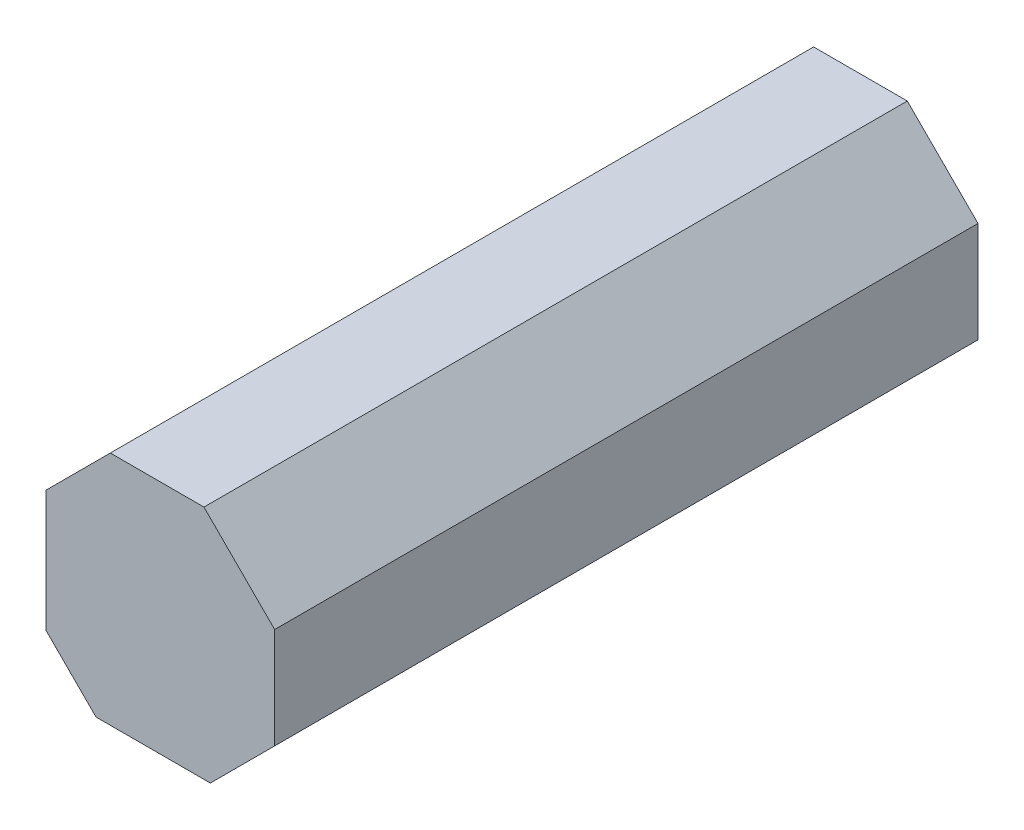
ISO-10303-21;
HEADER;
FILE_DESCRIPTION(('STEP AP214'),'2;1');
FILE_NAME('part.step','',(''),(''),'','','');
FILE_SCHEMA(('AUTOMOTIVE_DESIGN { 1 0 10303 214 1 1 1 1 }'));
ENDSEC;
DATA;
#1=APPLICATION_CONTEXT('core data for automotive mechanical design processes');
#2=APPLICATION_PROTOCOL_DEFINITION('international standard','automotive_design',2000,#1);
#3=PRODUCT_CONTEXT('',#1,'mechanical');
#4=PRODUCT('Part','Part','',(#3));
#5=PRODUCT_RELATED_PRODUCT_CATEGORY('part','',(#4));
#6=PRODUCT_DEFINITION_FORMATION('','',#4);
#7=PRODUCT_DEFINITION_CONTEXT('part definition',#1,'design');
#8=PRODUCT_DEFINITION('design','',#6,#7);
#9=PRODUCT_DEFINITION_SHAPE('','',#8);
#10=(LENGTH_UNIT() NAMED_UNIT(*) SI_UNIT(.MILLI.,.METRE.));
#11=(NAMED_UNIT(*) PLANE_ANGLE_UNIT() SI_UNIT($,.RADIAN.));
#12=(NAMED_UNIT(*) SI_UNIT($,.STERADIAN.) SOLID_ANGLE_UNIT());
#13=UNCERTAINTY_MEASURE_WITH_UNIT(LENGTH_MEASURE(1.E-05),#10,'distance_accuracy_value','');
#14=(GEOMETRIC_REPRESENTATION_CONTEXT(3) GLOBAL_UNCERTAINTY_ASSIGNED_CONTEXT((#13)) GLOBAL_UNIT_ASSIGNED_CONTEXT((#10,
#11,#12)) REPRESENTATION_CONTEXT('',''));
#15=CARTESIAN_POINT('',(0.,0.,0.));
#16=DIRECTION('',(0.,0.,1.));
#17=DIRECTION('',(1.,0.,0.));
#18=AXIS2_PLACEMENT_3D('',#15,#16,#17);
#19=CARTESIAN_POINT('',(0.4064,-0.1905,0.));
#20=DIRECTION('',(-1.,0.,0.));
#21=DIRECTION('',(0.,0.,1.));
#22=AXIS2_PLACEMENT_3D('',#19,#20,#21);
#23=PLANE('',#22);
#24=DIRECTION('',(0.,0.,1.));
#25=VECTOR('',#24,1.);
#26=CARTESIAN_POINT('',(0.4064,0.16782288,0.));
#27=LINE('',#26,#25);
#28=CARTESIAN_POINT('',(0.4064,0.16782288,0.));
#29=VERTEX_POINT('',#28);
#30=CARTESIAN_POINT('',(0.4064,0.16782288,2.50000008));
#31=VERTEX_POINT('',#30);
#32=EDGE_CURVE('E93',#29,#31,#27,.T.);
#33=ORIENTED_EDGE('',*,*,#32,.T.);
#34=DIRECTION('',(0.,1.,0.));
#35=VECTOR('',#34,1.);
#36=CARTESIAN_POINT('',(0.4064,-0.1905,2.50000008));
#37=LINE('',#36,#35);
#38=CARTESIAN_POINT('',(0.4064,-0.1905,2.50000008));
#39=VERTEX_POINT('',#38);
#40=EDGE_CURVE('E20',#39,#31,#37,.T.);
#41=ORIENTED_EDGE('',*,*,#40,.F.);
#42=DIRECTION('',(0.,0.,1.));
#43=VECTOR('',#42,1.);
#44=CARTESIAN_POINT('',(0.4064,-0.1905,0.));
#45=LINE('',#44,#43);
#46=CARTESIAN_POINT('',(0.4064,-0.1905,0.));
#47=VERTEX_POINT('',#46);
#48=EDGE_CURVE('E103',#39,#47,#45,.F.);
#49=ORIENTED_EDGE('',*,*,#48,.T.);
#50=DIRECTION('',(0.,1.,0.));
#51=VECTOR('',#50,1.);
#52=CARTESIAN_POINT('',(0.4064,-0.1905,0.));
#53=LINE('',#52,#51);
#54=EDGE_CURVE('E78',#29,#47,#53,.F.);
#55=ORIENTED_EDGE('',*,*,#54,.F.);
#56=EDGE_LOOP('',(#33,#41,#49,#55));
#57=FACE_BOUND('',#56,.T.);
#58=ADVANCED_FACE('F17',(#57),#23,.F.);
#59=CARTESIAN_POINT('',(0.4064,0.16782288,0.));
#60=DIRECTION('',(-0.707106781186548,-0.707106781186548,0.));
#61=DIRECTION('',(0.707106781186548,-0.707106781186548,0.));
#62=AXIS2_PLACEMENT_3D('',#59,#60,#61);
#63=PLANE('',#62);
#64=DIRECTION('',(0.,0.,-1.));
#65=VECTOR('',#64,1.);
#66=CARTESIAN_POINT('',(0.15512288,0.4191,0.));
#67=LINE('',#66,#65);
#68=CARTESIAN_POINT('',(0.15512288,0.4191,0.));
#69=VERTEX_POINT('',#68);
#70=CARTESIAN_POINT('',(0.15512288,0.4191,2.50000008));
#71=VERTEX_POINT('',#70);
#72=EDGE_CURVE('E96',#69,#71,#67,.F.);
#73=ORIENTED_EDGE('',*,*,#72,.T.);
#74=DIRECTION('',(0.707106781186548,-0.707106781186548,0.));
#75=VECTOR('',#74,1.);
#76=CARTESIAN_POINT('',(0.4064,0.16782288,2.50000008));
#77=LINE('',#76,#75);
#78=EDGE_CURVE('E85',#31,#71,#77,.F.);
#79=ORIENTED_EDGE('',*,*,#78,.F.);
#80=ORIENTED_EDGE('',*,*,#32,.F.);
#81=DIRECTION('',(0.707106781186548,-0.707106781186548,0.));
#82=VECTOR('',#81,1.);
#83=CARTESIAN_POINT('',(0.4064,0.16782288,0.));
#84=LINE('',#83,#82);
#85=EDGE_CURVE('E97',#69,#29,#84,.T.);
#86=ORIENTED_EDGE('',*,*,#85,.F.);
#87=EDGE_LOOP('',(#73,#79,#80,#86));
#88=FACE_BOUND('',#87,.T.);
#89=ADVANCED_FACE('F92',(#88),#63,.F.);
#90=CARTESIAN_POINT('',(0.1778,-0.4191,0.));
#91=DIRECTION('',(-0.707106781186548,0.707106781186548,0.));
#92=DIRECTION('',(-0.707106781186548,-0.707106781186548,0.));
#93=AXIS2_PLACEMENT_3D('',#90,#91,#92);
#94=PLANE('',#93);
#95=ORIENTED_EDGE('',*,*,#48,.F.);
#96=DIRECTION('',(-0.707106781186548,-0.707106781186548,0.));
#97=VECTOR('',#96,1.);
#98=CARTESIAN_POINT('',(0.1778,-0.4191,2.50000008));
#99=LINE('',#98,#97);
#100=CARTESIAN_POINT('',(0.1778,-0.4191,2.50000008));
#101=VERTEX_POINT('',#100);
#102=EDGE_CURVE('E88',#101,#39,#99,.F.);
#103=ORIENTED_EDGE('',*,*,#102,.F.);
#104=DIRECTION('',(0.,0.,1.));
#105=VECTOR('',#104,1.);
#106=CARTESIAN_POINT('',(0.1778,-0.4191,0.));
#107=LINE('',#106,#105);
#108=CARTESIAN_POINT('',(0.1778,-0.4191,0.));
#109=VERTEX_POINT('',#108);
#110=EDGE_CURVE('E113',#101,#109,#107,.F.);
#111=ORIENTED_EDGE('',*,*,#110,.T.);
#112=DIRECTION('',(-0.707106781186548,-0.707106781186548,0.));
#113=VECTOR('',#112,1.);
#114=CARTESIAN_POINT('',(0.1778,-0.4191,0.));
#115=LINE('',#114,#113);
#116=EDGE_CURVE('E105',#47,#109,#115,.T.);
#117=ORIENTED_EDGE('',*,*,#116,.F.);
#118=EDGE_LOOP('',(#95,#103,#111,#117));
#119=FACE_BOUND('',#118,.T.);
#120=ADVANCED_FACE('F176',(#119),#94,.F.);
#121=CARTESIAN_POINT('',(0.15512288,0.4191,0.));
#122=DIRECTION('',(0.,-1.,0.));
#123=DIRECTION('',(0.,0.,-1.));
#124=AXIS2_PLACEMENT_3D('',#121,#122,#123);
#125=PLANE('',#124);
#126=DIRECTION('',(0.,0.,1.));
#127=VECTOR('',#126,1.);
#128=CARTESIAN_POINT('',(-0.1778,0.4191,0.));
#129=LINE('',#128,#127);
#130=CARTESIAN_POINT('',(-0.1778,0.4191,0.));
#131=VERTEX_POINT('',#130);
#132=CARTESIAN_POINT('',(-0.1778,0.4191,2.50000008));
#133=VERTEX_POINT('',#132);
#134=EDGE_CURVE('E118',#131,#133,#129,.T.);
#135=ORIENTED_EDGE('',*,*,#134,.T.);
#136=DIRECTION('',(1.,0.,0.));
#137=VECTOR('',#136,1.);
#138=CARTESIAN_POINT('',(0.15512288,0.4191,2.50000008));
#139=LINE('',#138,#137);
#140=EDGE_CURVE('E108',#71,#133,#139,.F.);
#141=ORIENTED_EDGE('',*,*,#140,.F.);
#142=ORIENTED_EDGE('',*,*,#72,.F.);
#143=DIRECTION('',(1.,0.,0.));
#144=VECTOR('',#143,1.);
#145=CARTESIAN_POINT('',(0.15512288,0.4191,0.));
#146=LINE('',#145,#144);
#147=EDGE_CURVE('E110',#131,#69,#146,.T.);
#148=ORIENTED_EDGE('',*,*,#147,.F.);
#149=EDGE_LOOP('',(#135,#141,#142,#148));
#150=FACE_BOUND('',#149,.T.);
#151=ADVANCED_FACE('F172',(#150),#125,.F.);
#152=CARTESIAN_POINT('',(-0.2286,-0.4191,0.));
#153=DIRECTION('',(0.,1.,0.));
#154=DIRECTION('',(0.,0.,1.));
#155=AXIS2_PLACEMENT_3D('',#152,#153,#154);
#156=PLANE('',#155);
#157=ORIENTED_EDGE('',*,*,#110,.F.);
#158=DIRECTION('',(-1.,0.,0.));
#159=VECTOR('',#158,1.);
#160=CARTESIAN_POINT('',(0.15512288,-0.4191,2.50000008));
#161=LINE('',#160,#159);
#162=CARTESIAN_POINT('',(-0.228599999999969,-0.419099999999969,2.50000008));
#163=VERTEX_POINT('',#162);
#164=EDGE_CURVE('E121',#101,#163,#161,.T.);
#165=ORIENTED_EDGE('',*,*,#164,.T.);
#166=DIRECTION('',(0.,0.,1.));
#167=VECTOR('',#166,1.);
#168=CARTESIAN_POINT('',(-0.228599999999874,-0.419099999999874,0.));
#169=LINE('',#168,#167);
#170=CARTESIAN_POINT('',(-0.228599999999969,-0.419099999999969,0.));
#171=VERTEX_POINT('',#170);
#172=EDGE_CURVE('E129',#163,#171,#169,.F.);
#173=ORIENTED_EDGE('',*,*,#172,.T.);
#174=DIRECTION('',(1.,0.,0.));
#175=VECTOR('',#174,1.);
#176=CARTESIAN_POINT('',(-0.2286,-0.4191,0.));
#177=LINE('',#176,#175);
#178=EDGE_CURVE('E116',#109,#171,#177,.F.);
#179=ORIENTED_EDGE('',*,*,#178,.F.);
#180=EDGE_LOOP('',(#157,#165,#173,#179));
#181=FACE_BOUND('',#180,.T.);
#182=ADVANCED_FACE('F169',(#181),#156,.F.);
#183=CARTESIAN_POINT('',(-0.1778,0.4191,0.));
#184=DIRECTION('',(0.707106781186548,-0.707106781186548,0.));
#185=DIRECTION('',(0.707106781186548,0.707106781186548,0.));
#186=AXIS2_PLACEMENT_3D('',#183,#184,#185);
#187=PLANE('',#186);
#188=DIRECTION('',(0.,0.,-1.));
#189=VECTOR('',#188,1.);
#190=CARTESIAN_POINT('',(-0.4064,0.1905,0.));
#191=LINE('',#190,#189);
#192=CARTESIAN_POINT('',(-0.4064,0.1905,0.));
#193=VERTEX_POINT('',#192);
#194=CARTESIAN_POINT('',(-0.4064,0.1905,2.50000008));
#195=VERTEX_POINT('',#194);
#196=EDGE_CURVE('E136',#193,#195,#191,.F.);
#197=ORIENTED_EDGE('',*,*,#196,.T.);
#198=DIRECTION('',(0.707106781186548,0.707106781186547,0.));
#199=VECTOR('',#198,1.);
#200=CARTESIAN_POINT('',(-0.4064,0.1905,2.50000008));
#201=LINE('',#200,#199);
#202=EDGE_CURVE('E123',#195,#133,#201,.T.);
#203=ORIENTED_EDGE('',*,*,#202,.T.);
#204=ORIENTED_EDGE('',*,*,#134,.F.);
#205=DIRECTION('',(0.707106781186548,0.707106781186547,0.));
#206=VECTOR('',#205,1.);
#207=CARTESIAN_POINT('',(-0.4064,0.1905,0.));
#208=LINE('',#207,#206);
#209=EDGE_CURVE('E133',#193,#131,#208,.T.);
#210=ORIENTED_EDGE('',*,*,#209,.F.);
#211=EDGE_LOOP('',(#197,#203,#204,#210));
#212=FACE_BOUND('',#211,.T.);
#213=ADVANCED_FACE('F152',(#212),#187,.F.);
#214=CARTESIAN_POINT('',(0.15512288,0.4191,2.50000008));
#215=DIRECTION('',(0.,0.,-1.));
#216=DIRECTION('',(-1.,0.,0.));
#217=AXIS2_PLACEMENT_3D('',#214,#215,#216);
#218=PLANE('',#217);
#219=ORIENTED_EDGE('',*,*,#202,.F.);
#220=DIRECTION('',(0.,1.,0.));
#221=VECTOR('',#220,1.);
#222=CARTESIAN_POINT('',(-0.4064,0.1905,2.50000008));
#223=LINE('',#222,#221);
#224=CARTESIAN_POINT('',(-0.4064,-0.2413,2.50000008));
#225=VERTEX_POINT('',#224);
#226=EDGE_CURVE('E139',#195,#225,#223,.F.);
#227=ORIENTED_EDGE('',*,*,#226,.T.);
#228=DIRECTION('',(-0.707106781187048,0.707106781186048,0.));
#229=VECTOR('',#228,1.);
#230=CARTESIAN_POINT('',(-0.4064,-0.2413,2.50000008));
#231=LINE('',#230,#229);
#232=EDGE_CURVE('E126',#225,#163,#231,.F.);
#233=ORIENTED_EDGE('',*,*,#232,.T.);
#234=ORIENTED_EDGE('',*,*,#164,.F.);
#235=ORIENTED_EDGE('',*,*,#102,.T.);
#236=ORIENTED_EDGE('',*,*,#40,.T.);
#237=ORIENTED_EDGE('',*,*,#78,.T.);
#238=ORIENTED_EDGE('',*,*,#140,.T.);
#239=EDGE_LOOP('',(#219,#227,#233,#234,#235,#236,#237,#238));
#240=FACE_BOUND('',#239,.T.);
#241=ADVANCED_FACE('F84',(#240),#218,.F.);
#242=CARTESIAN_POINT('',(-0.4064,-0.2413,0.));
#243=DIRECTION('',(0.707106781186048,0.707106781187048,0.));
#244=DIRECTION('',(-0.707106781187048,0.707106781186048,0.));
#245=AXIS2_PLACEMENT_3D('',#242,#243,#244);
#246=PLANE('',#245);
#247=ORIENTED_EDGE('',*,*,#172,.F.);
#248=ORIENTED_EDGE('',*,*,#232,.F.);
#249=DIRECTION('',(0.,0.,-1.));
#250=VECTOR('',#249,1.);
#251=CARTESIAN_POINT('',(-0.4064,-0.2413,0.));
#252=LINE('',#251,#250);
#253=CARTESIAN_POINT('',(-0.4064,-0.2413,0.));
#254=VERTEX_POINT('',#253);
#255=EDGE_CURVE('E26',#225,#254,#252,.T.);
#256=ORIENTED_EDGE('',*,*,#255,.T.);
#257=DIRECTION('',(-0.707106781186548,0.707106781186548,0.));
#258=VECTOR('',#257,1.);
#259=CARTESIAN_POINT('',(-0.2286,-0.4191,0.));
#260=LINE('',#259,#258);
#261=EDGE_CURVE('E34',#171,#254,#260,.T.);
#262=ORIENTED_EDGE('',*,*,#261,.F.);
#263=EDGE_LOOP('',(#247,#248,#256,#262));
#264=FACE_BOUND('',#263,.T.);
#265=ADVANCED_FACE('F146',(#264),#246,.F.);
#266=CARTESIAN_POINT('',(0.15512288,0.4191,0.));
#267=DIRECTION('',(0.,0.,-1.));
#268=DIRECTION('',(-1.,0.,0.));
#269=AXIS2_PLACEMENT_3D('',#266,#267,#268);
#270=PLANE('',#269);
#271=ORIENTED_EDGE('',*,*,#209,.T.);
#272=ORIENTED_EDGE('',*,*,#147,.T.);
#273=ORIENTED_EDGE('',*,*,#85,.T.);
#274=ORIENTED_EDGE('',*,*,#54,.T.);
#275=ORIENTED_EDGE('',*,*,#116,.T.);
#276=ORIENTED_EDGE('',*,*,#178,.T.);
#277=ORIENTED_EDGE('',*,*,#261,.T.);
#278=DIRECTION('',(0.,1.,0.));
#279=VECTOR('',#278,1.);
#280=CARTESIAN_POINT('',(-0.4064,0.1905,0.));
#281=LINE('',#280,#279);
#282=EDGE_CURVE('E11',#254,#193,#281,.T.);
#283=ORIENTED_EDGE('',*,*,#282,.T.);
#284=EDGE_LOOP('',(#271,#272,#273,#274,#275,#276,#277,#283));
#285=FACE_BOUND('',#284,.T.);
#286=ADVANCED_FACE('F154',(#285),#270,.T.);
#287=CARTESIAN_POINT('',(-0.4064,0.1905,0.));
#288=DIRECTION('',(1.,0.,0.));
#289=DIRECTION('',(0.,0.,-1.));
#290=AXIS2_PLACEMENT_3D('',#287,#288,#289);
#291=PLANE('',#290);
#292=ORIENTED_EDGE('',*,*,#255,.F.);
#293=ORIENTED_EDGE('',*,*,#226,.F.);
#294=ORIENTED_EDGE('',*,*,#196,.F.);
#295=ORIENTED_EDGE('',*,*,#282,.F.);
#296=EDGE_LOOP('',(#292,#293,#294,#295));
#297=FACE_BOUND('',#296,.T.);
#298=ADVANCED_FACE('F149',(#297),#291,.F.);
#299=CLOSED_SHELL('',(#58,#89,#120,#151,#182,#213,#241,#265,#286,#298));
#300=MANIFOLD_SOLID_BREP('B1',#299);
#301=ADVANCED_BREP_SHAPE_REPRESENTATION('',(#18,#300),#14);
#302=SHAPE_DEFINITION_REPRESENTATION(#9,#301);
ENDSEC;
END-ISO-10303-21;
